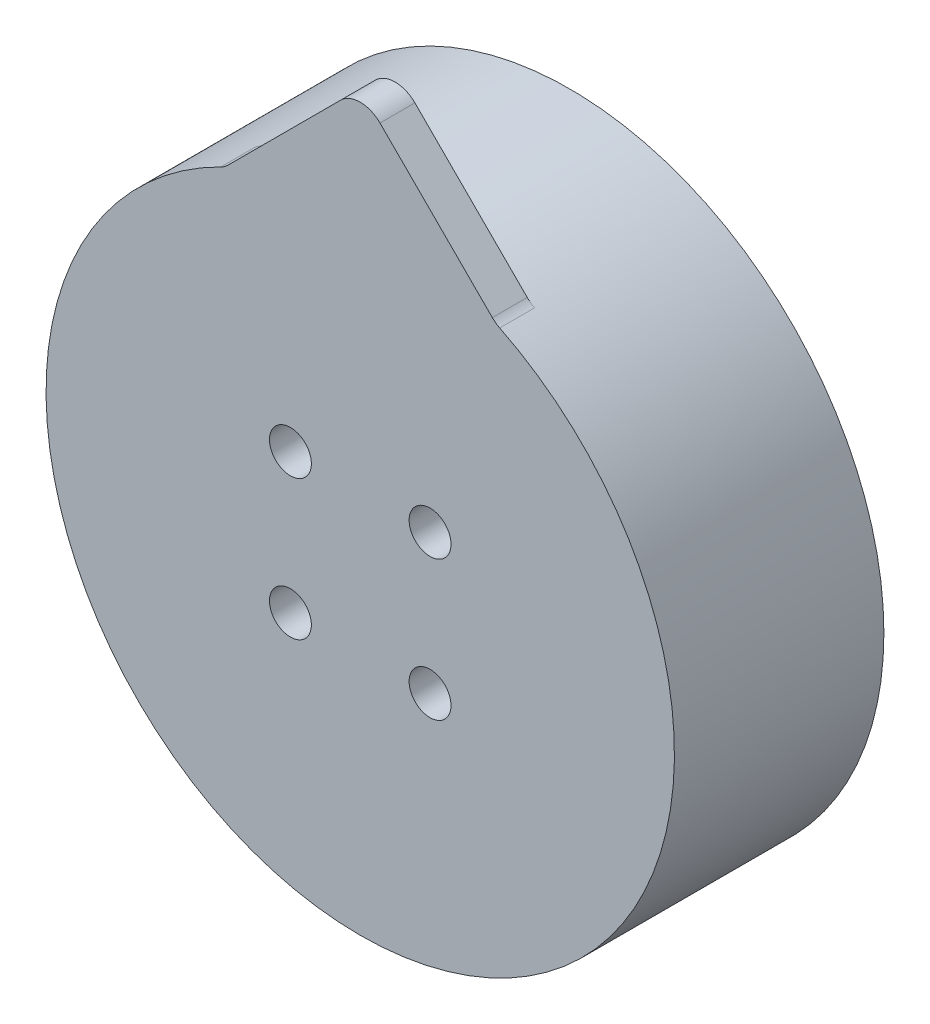
ISO-10303-21;
HEADER;
FILE_DESCRIPTION(('STEP AP214'),'2;1');
FILE_NAME('part.step','',(''),(''),'','','');
FILE_SCHEMA(('AUTOMOTIVE_DESIGN { 1 0 10303 214 1 1 1 1 }'));
ENDSEC;
DATA;
#1=APPLICATION_CONTEXT('core data for automotive mechanical design processes');
#2=APPLICATION_PROTOCOL_DEFINITION('international standard','automotive_design',2000,#1);
#3=PRODUCT_CONTEXT('',#1,'mechanical');
#4=PRODUCT('Part','Part','',(#3));
#5=PRODUCT_RELATED_PRODUCT_CATEGORY('part','',(#4));
#6=PRODUCT_DEFINITION_FORMATION('','',#4);
#7=PRODUCT_DEFINITION_CONTEXT('part definition',#1,'design');
#8=PRODUCT_DEFINITION('design','',#6,#7);
#9=PRODUCT_DEFINITION_SHAPE('','',#8);
#10=(LENGTH_UNIT() NAMED_UNIT(*) SI_UNIT(.MILLI.,.METRE.));
#11=(NAMED_UNIT(*) PLANE_ANGLE_UNIT() SI_UNIT($,.RADIAN.));
#12=(NAMED_UNIT(*) SI_UNIT($,.STERADIAN.) SOLID_ANGLE_UNIT());
#13=UNCERTAINTY_MEASURE_WITH_UNIT(LENGTH_MEASURE(1.E-05),#10,'distance_accuracy_value','');
#14=(GEOMETRIC_REPRESENTATION_CONTEXT(3) GLOBAL_UNCERTAINTY_ASSIGNED_CONTEXT((#13)) GLOBAL_UNIT_ASSIGNED_CONTEXT((#10,
#11,#12)) REPRESENTATION_CONTEXT('',''));
#15=CARTESIAN_POINT('',(0.,0.,0.));
#16=DIRECTION('',(0.,0.,1.));
#17=DIRECTION('',(1.,0.,0.));
#18=AXIS2_PLACEMENT_3D('',#15,#16,#17);
#19=CARTESIAN_POINT('',(0.,0.,12.7));
#20=DIRECTION('',(0.,0.,-1.));
#21=DIRECTION('',(-1.,0.,0.));
#22=AXIS2_PLACEMENT_3D('',#19,#20,#21);
#23=CYLINDRICAL_SURFACE('',#22,21.844);
#24=DIRECTION('',(0.,0.,-1.));
#25=VECTOR('',#24,1.);
#26=CARTESIAN_POINT('',(16.5270415262115,14.2834601687015,6.35));
#27=LINE('',#26,#25);
#28=CARTESIAN_POINT('',(16.5270415262115,14.2834601687015,0.));
#29=VERTEX_POINT('',#28);
#30=CARTESIAN_POINT('',(16.5270415262115,14.2834601687015,12.7));
#31=VERTEX_POINT('',#30);
#32=EDGE_CURVE('E282',#29,#31,#27,.F.);
#33=ORIENTED_EDGE('',*,*,#32,.F.);
#34=CARTESIAN_POINT('',(0.,0.,0.));
#35=DIRECTION('',(0.,0.,1.));
#36=DIRECTION('',(1.,0.,0.));
#37=AXIS2_PLACEMENT_3D('',#34,#35,#36);
#38=CIRCLE('',#37,21.844);
#39=CARTESIAN_POINT('',(21.7863146802326,1.58645159203908,0.));
#40=VERTEX_POINT('',#39);
#41=EDGE_CURVE('E212',#40,#29,#38,.T.);
#42=ORIENTED_EDGE('',*,*,#41,.F.);
#43=DIRECTION('',(0.,0.,-1.));
#44=VECTOR('',#43,1.);
#45=CARTESIAN_POINT('',(21.7863146802326,1.58645159203908,6.35));
#46=LINE('',#45,#44);
#47=CARTESIAN_POINT('',(21.7863146802326,1.5864515920391,12.7));
#48=VERTEX_POINT('',#47);
#49=EDGE_CURVE('E289',#48,#40,#46,.T.);
#50=ORIENTED_EDGE('',*,*,#49,.F.);
#51=CARTESIAN_POINT('',(0.,0.,12.7));
#52=DIRECTION('',(0.,0.,1.));
#53=DIRECTION('',(1.,0.,0.));
#54=AXIS2_PLACEMENT_3D('',#51,#52,#53);
#55=CIRCLE('',#54,21.844);
#56=EDGE_CURVE('E218',#48,#31,#55,.T.);
#57=ORIENTED_EDGE('',*,*,#56,.T.);
#58=EDGE_LOOP('',(#33,#42,#50,#57));
#59=FACE_BOUND('',#58,.T.);
#60=ADVANCED_FACE('F33',(#59),#23,.F.);
#61=DIRECTION('',(0.,0.,-1.));
#62=VECTOR('',#61,1.);
#63=CARTESIAN_POINT('',(21.7863146802326,-1.58645159203908,6.35));
#64=LINE('',#63,#62);
#65=CARTESIAN_POINT('',(21.7863146802326,-1.58645159203908,0.));
#66=VERTEX_POINT('',#65);
#67=CARTESIAN_POINT('',(21.7863146802326,-1.58645159203908,12.7));
#68=VERTEX_POINT('',#67);
#69=EDGE_CURVE('E287',#66,#68,#64,.F.);
#70=ORIENTED_EDGE('',*,*,#69,.F.);
#71=CARTESIAN_POINT('',(16.5270415262115,-14.2834601687015,0.));
#72=VERTEX_POINT('',#71);
#73=EDGE_CURVE('E217',#72,#66,#38,.T.);
#74=ORIENTED_EDGE('',*,*,#73,.F.);
#75=DIRECTION('',(0.,0.,-1.));
#76=VECTOR('',#75,1.);
#77=CARTESIAN_POINT('',(16.5270415262115,-14.2834601687015,6.35));
#78=LINE('',#77,#76);
#79=CARTESIAN_POINT('',(16.5270415262115,-14.2834601687015,12.7));
#80=VERTEX_POINT('',#79);
#81=EDGE_CURVE('E293',#80,#72,#78,.T.);
#82=ORIENTED_EDGE('',*,*,#81,.F.);
#83=EDGE_CURVE('E263',#80,#68,#55,.T.);
#84=ORIENTED_EDGE('',*,*,#83,.T.);
#85=EDGE_LOOP('',(#70,#74,#82,#84));
#86=FACE_BOUND('',#85,.T.);
#87=ADVANCED_FACE('F455',(#86),#23,.F.);
#88=DIRECTION('',(0.,0.,-1.));
#89=VECTOR('',#88,1.);
#90=CARTESIAN_POINT('',(14.2834601687014,-16.5270415262115,6.35));
#91=LINE('',#90,#89);
#92=CARTESIAN_POINT('',(14.2834601687014,-16.5270415262115,0.));
#93=VERTEX_POINT('',#92);
#94=CARTESIAN_POINT('',(14.2834601687014,-16.5270415262115,12.7));
#95=VERTEX_POINT('',#94);
#96=EDGE_CURVE('E291',#93,#95,#91,.F.);
#97=ORIENTED_EDGE('',*,*,#96,.F.);
#98=CARTESIAN_POINT('',(1.58645159203907,-21.7863146802326,0.));
#99=VERTEX_POINT('',#98);
#100=EDGE_CURVE('E469',#99,#93,#38,.T.);
#101=ORIENTED_EDGE('',*,*,#100,.F.);
#102=DIRECTION('',(0.,0.,-1.));
#103=VECTOR('',#102,1.);
#104=CARTESIAN_POINT('',(1.58645159203907,-21.7863146802326,6.35));
#105=LINE('',#104,#103);
#106=CARTESIAN_POINT('',(1.5864515920391,-21.7863146802326,12.7));
#107=VERTEX_POINT('',#106);
#108=EDGE_CURVE('E297',#107,#99,#105,.T.);
#109=ORIENTED_EDGE('',*,*,#108,.F.);
#110=EDGE_CURVE('E442',#107,#95,#55,.T.);
#111=ORIENTED_EDGE('',*,*,#110,.T.);
#112=EDGE_LOOP('',(#97,#101,#109,#111));
#113=FACE_BOUND('',#112,.T.);
#114=ADVANCED_FACE('F498',(#113),#23,.F.);
#115=DIRECTION('',(0.,0.,-1.));
#116=VECTOR('',#115,1.);
#117=CARTESIAN_POINT('',(-1.58645159203908,-21.7863146802326,6.35));
#118=LINE('',#117,#116);
#119=CARTESIAN_POINT('',(-1.58645159203908,-21.7863146802326,0.));
#120=VERTEX_POINT('',#119);
#121=CARTESIAN_POINT('',(-1.58645159203908,-21.7863146802326,12.7));
#122=VERTEX_POINT('',#121);
#123=EDGE_CURVE('E295',#120,#122,#118,.F.);
#124=ORIENTED_EDGE('',*,*,#123,.F.);
#125=CARTESIAN_POINT('',(-14.2834601687014,-16.5270415262115,0.));
#126=VERTEX_POINT('',#125);
#127=EDGE_CURVE('E470',#126,#120,#38,.T.);
#128=ORIENTED_EDGE('',*,*,#127,.F.);
#129=DIRECTION('',(0.,0.,-1.));
#130=VECTOR('',#129,1.);
#131=CARTESIAN_POINT('',(-14.2834601687014,-16.5270415262115,6.35));
#132=LINE('',#131,#130);
#133=CARTESIAN_POINT('',(-14.2834601687014,-16.5270415262115,12.7));
#134=VERTEX_POINT('',#133);
#135=EDGE_CURVE('E301',#134,#126,#132,.T.);
#136=ORIENTED_EDGE('',*,*,#135,.F.);
#137=EDGE_CURVE('E436',#134,#122,#55,.T.);
#138=ORIENTED_EDGE('',*,*,#137,.T.);
#139=EDGE_LOOP('',(#124,#128,#136,#138));
#140=FACE_BOUND('',#139,.T.);
#141=ADVANCED_FACE('F492',(#140),#23,.F.);
#142=DIRECTION('',(0.,0.,-1.));
#143=VECTOR('',#142,1.);
#144=CARTESIAN_POINT('',(-16.5270415262115,-14.2834601687015,6.35));
#145=LINE('',#144,#143);
#146=CARTESIAN_POINT('',(-16.5270415262115,-14.2834601687015,0.));
#147=VERTEX_POINT('',#146);
#148=CARTESIAN_POINT('',(-16.5270415262115,-14.2834601687015,12.7));
#149=VERTEX_POINT('',#148);
#150=EDGE_CURVE('E299',#147,#149,#145,.F.);
#151=ORIENTED_EDGE('',*,*,#150,.F.);
#152=CARTESIAN_POINT('',(-21.7863146802326,-1.58645159203908,0.));
#153=VERTEX_POINT('',#152);
#154=EDGE_CURVE('E213',#153,#147,#38,.T.);
#155=ORIENTED_EDGE('',*,*,#154,.F.);
#156=DIRECTION('',(0.,0.,-1.));
#157=VECTOR('',#156,1.);
#158=CARTESIAN_POINT('',(-21.7863146802326,-1.58645159203908,6.35));
#159=LINE('',#158,#157);
#160=CARTESIAN_POINT('',(-21.7863146802326,-1.5864515920391,12.7));
#161=VERTEX_POINT('',#160);
#162=EDGE_CURVE('E305',#161,#153,#159,.T.);
#163=ORIENTED_EDGE('',*,*,#162,.F.);
#164=EDGE_CURVE('E431',#161,#149,#55,.T.);
#165=ORIENTED_EDGE('',*,*,#164,.T.);
#166=EDGE_LOOP('',(#151,#155,#163,#165));
#167=FACE_BOUND('',#166,.T.);
#168=ADVANCED_FACE('F479',(#167),#23,.F.);
#169=DIRECTION('',(0.,0.,-1.));
#170=VECTOR('',#169,1.);
#171=CARTESIAN_POINT('',(-21.7863146802326,1.58645159203908,6.35));
#172=LINE('',#171,#170);
#173=CARTESIAN_POINT('',(-21.7863146802326,1.58645159203908,0.));
#174=VERTEX_POINT('',#173);
#175=CARTESIAN_POINT('',(-21.7863146802326,1.58645159203908,12.7));
#176=VERTEX_POINT('',#175);
#177=EDGE_CURVE('E303',#174,#176,#172,.F.);
#178=ORIENTED_EDGE('',*,*,#177,.F.);
#179=CARTESIAN_POINT('',(-16.5270415262115,14.2834601687015,0.));
#180=VERTEX_POINT('',#179);
#181=EDGE_CURVE('E210',#180,#174,#38,.T.);
#182=ORIENTED_EDGE('',*,*,#181,.F.);
#183=DIRECTION('',(0.,0.,-1.));
#184=VECTOR('',#183,1.);
#185=CARTESIAN_POINT('',(-16.5270415262115,14.2834601687015,6.35));
#186=LINE('',#185,#184);
#187=CARTESIAN_POINT('',(-16.5270415262115,14.2834601687015,12.7));
#188=VERTEX_POINT('',#187);
#189=EDGE_CURVE('E186',#188,#180,#186,.T.);
#190=ORIENTED_EDGE('',*,*,#189,.F.);
#191=EDGE_CURVE('E429',#188,#176,#55,.T.);
#192=ORIENTED_EDGE('',*,*,#191,.T.);
#193=EDGE_LOOP('',(#178,#182,#190,#192));
#194=FACE_BOUND('',#193,.T.);
#195=ADVANCED_FACE('F484',(#194),#23,.F.);
#196=DIRECTION('',(0.,0.,-1.));
#197=VECTOR('',#196,1.);
#198=CARTESIAN_POINT('',(14.2834601687014,16.5270415262115,6.35));
#199=LINE('',#198,#197);
#200=CARTESIAN_POINT('',(14.2834601687014,16.5270415262115,12.7));
#201=VERTEX_POINT('',#200);
#202=CARTESIAN_POINT('',(14.2834601687014,16.5270415262115,0.));
#203=VERTEX_POINT('',#202);
#204=EDGE_CURVE('E285',#201,#203,#199,.T.);
#205=ORIENTED_EDGE('',*,*,#204,.F.);
#206=CARTESIAN_POINT('',(1.58645159203907,21.7863146802326,12.7));
#207=VERTEX_POINT('',#206);
#208=EDGE_CURVE('E423',#201,#207,#55,.T.);
#209=ORIENTED_EDGE('',*,*,#208,.T.);
#210=DIRECTION('',(0.,0.,-1.));
#211=VECTOR('',#210,1.);
#212=CARTESIAN_POINT('',(1.58645159203907,21.7863146802326,6.35));
#213=LINE('',#212,#211);
#214=CARTESIAN_POINT('',(1.58645159203907,21.7863146802326,0.));
#215=VERTEX_POINT('',#214);
#216=EDGE_CURVE('E307',#215,#207,#213,.F.);
#217=ORIENTED_EDGE('',*,*,#216,.F.);
#218=EDGE_CURVE('E209',#203,#215,#38,.T.);
#219=ORIENTED_EDGE('',*,*,#218,.F.);
#220=EDGE_LOOP('',(#205,#209,#217,#219));
#221=FACE_BOUND('',#220,.T.);
#222=ADVANCED_FACE('F486',(#221),#23,.F.);
#223=CARTESIAN_POINT('',(0.,0.,0.));
#224=DIRECTION('',(0.,0.,1.));
#225=DIRECTION('',(1.,0.,0.));
#226=AXIS2_PLACEMENT_3D('',#223,#224,#225);
#227=PLANE('',#226);
#228=CARTESIAN_POINT('',(0.,0.,0.));
#229=DIRECTION('',(0.,0.,1.));
#230=DIRECTION('',(1.,0.,0.));
#231=AXIS2_PLACEMENT_3D('',#228,#229,#230);
#232=CIRCLE('',#231,28.575);
#233=CARTESIAN_POINT('',(28.575,0.,0.));
#234=VERTEX_POINT('',#233);
#235=EDGE_CURVE('E216',#234,#234,#232,.T.);
#236=ORIENTED_EDGE('',*,*,#235,.F.);
#237=EDGE_LOOP('',(#236));
#238=FACE_BOUND('',#237,.T.);
#239=ORIENTED_EDGE('',*,*,#41,.T.);
#240=CARTESIAN_POINT('',(15.4460405282389,15.446040528239,0.));
#241=DIRECTION('',(0.,0.,-1.));
#242=DIRECTION('',(-1.,0.,0.));
#243=AXIS2_PLACEMENT_3D('',#240,#241,#242);
#244=CIRCLE('',#243,1.5875);
#245=EDGE_CURVE('E316',#203,#29,#244,.T.);
#246=ORIENTED_EDGE('',*,*,#245,.F.);
#247=ORIENTED_EDGE('',*,*,#218,.T.);
#248=CARTESIAN_POINT('',(0.,21.844,0.));
#249=DIRECTION('',(0.,0.,-1.));
#250=DIRECTION('',(-1.,0.,0.));
#251=AXIS2_PLACEMENT_3D('',#248,#249,#250);
#252=CIRCLE('',#251,1.5875);
#253=CARTESIAN_POINT('',(-1.58645159203908,21.7863146802326,0.));
#254=VERTEX_POINT('',#253);
#255=EDGE_CURVE('E208',#254,#215,#252,.T.);
#256=ORIENTED_EDGE('',*,*,#255,.F.);
#257=CARTESIAN_POINT('',(-14.2834601687014,16.5270415262115,0.));
#258=VERTEX_POINT('',#257);
#259=EDGE_CURVE('E199',#254,#258,#38,.T.);
#260=ORIENTED_EDGE('',*,*,#259,.T.);
#261=CARTESIAN_POINT('',(-15.4460405282389,15.446040528239,0.));
#262=DIRECTION('',(0.,0.,-1.));
#263=DIRECTION('',(-1.,0.,0.));
#264=AXIS2_PLACEMENT_3D('',#261,#262,#263);
#265=CIRCLE('',#264,1.5875);
#266=EDGE_CURVE('E180',#180,#258,#265,.T.);
#267=ORIENTED_EDGE('',*,*,#266,.F.);
#268=ORIENTED_EDGE('',*,*,#181,.T.);
#269=CARTESIAN_POINT('',(-21.844,0.,0.));
#270=DIRECTION('',(0.,0.,-1.));
#271=DIRECTION('',(-1.,0.,0.));
#272=AXIS2_PLACEMENT_3D('',#269,#270,#271);
#273=CIRCLE('',#272,1.5875);
#274=EDGE_CURVE('E333',#153,#174,#273,.T.);
#275=ORIENTED_EDGE('',*,*,#274,.F.);
#276=ORIENTED_EDGE('',*,*,#154,.T.);
#277=CARTESIAN_POINT('',(-15.4460405282389,-15.446040528239,0.));
#278=DIRECTION('',(0.,0.,-1.));
#279=DIRECTION('',(-1.,0.,0.));
#280=AXIS2_PLACEMENT_3D('',#277,#278,#279);
#281=CIRCLE('',#280,1.5875);
#282=EDGE_CURVE('E328',#126,#147,#281,.T.);
#283=ORIENTED_EDGE('',*,*,#282,.F.);
#284=ORIENTED_EDGE('',*,*,#127,.T.);
#285=CARTESIAN_POINT('',(0.,-21.844,0.));
#286=DIRECTION('',(0.,0.,-1.));
#287=DIRECTION('',(-1.,0.,0.));
#288=AXIS2_PLACEMENT_3D('',#285,#286,#287);
#289=CIRCLE('',#288,1.5875);
#290=EDGE_CURVE('E325',#99,#120,#289,.T.);
#291=ORIENTED_EDGE('',*,*,#290,.F.);
#292=ORIENTED_EDGE('',*,*,#100,.T.);
#293=CARTESIAN_POINT('',(15.4460405282389,-15.446040528239,0.));
#294=DIRECTION('',(0.,0.,-1.));
#295=DIRECTION('',(-1.,0.,0.));
#296=AXIS2_PLACEMENT_3D('',#293,#294,#295);
#297=CIRCLE('',#296,1.5875);
#298=EDGE_CURVE('E322',#72,#93,#297,.T.);
#299=ORIENTED_EDGE('',*,*,#298,.F.);
#300=ORIENTED_EDGE('',*,*,#73,.T.);
#301=CARTESIAN_POINT('',(21.844,0.,0.));
#302=DIRECTION('',(0.,0.,-1.));
#303=DIRECTION('',(-1.,0.,0.));
#304=AXIS2_PLACEMENT_3D('',#301,#302,#303);
#305=CIRCLE('',#304,1.5875);
#306=EDGE_CURVE('E315',#40,#66,#305,.T.);
#307=ORIENTED_EDGE('',*,*,#306,.F.);
#308=EDGE_LOOP('',(#239,#246,#247,#256,#260,#267,#268,#275,#276,#283,#284,#291,#292,#299,#300,#307));
#309=FACE_BOUND('',#308,.T.);
#310=ADVANCED_FACE('F206',(#238,#309),#227,.F.);
#311=CARTESIAN_POINT('',(0.,0.,12.7));
#312=DIRECTION('',(0.,0.,-1.));
#313=DIRECTION('',(-1.,0.,0.));
#314=AXIS2_PLACEMENT_3D('',#311,#312,#313);
#315=CYLINDRICAL_SURFACE('',#314,28.575);
#316=CARTESIAN_POINT('',(0.,0.,15.875));
#317=DIRECTION('',(0.,0.,-1.));
#318=DIRECTION('',(1.,0.,0.));
#319=AXIS2_PLACEMENT_3D('',#316,#317,#318);
#320=CIRCLE('',#319,28.575);
#321=CARTESIAN_POINT('',(-12.6821476936652,25.6065178201969,15.875));
#322=VERTEX_POINT('',#321);
#323=CARTESIAN_POINT('',(12.6821476936652,25.6065178201969,15.875));
#324=VERTEX_POINT('',#323);
#325=EDGE_CURVE('E270',#322,#324,#320,.T.);
#326=ORIENTED_EDGE('',*,*,#325,.T.);
#327=DIRECTION('',(0.,0.,-1.));
#328=VECTOR('',#327,1.);
#329=CARTESIAN_POINT('',(12.6821476936652,25.6065178201969,12.7));
#330=LINE('',#329,#328);
#331=CARTESIAN_POINT('',(12.6821476936652,25.6065178201969,19.05));
#332=VERTEX_POINT('',#331);
#333=EDGE_CURVE('E239',#324,#332,#330,.F.);
#334=ORIENTED_EDGE('',*,*,#333,.T.);
#335=CARTESIAN_POINT('',(0.,0.,19.05));
#336=DIRECTION('',(0.,0.,1.));
#337=DIRECTION('',(1.,0.,0.));
#338=AXIS2_PLACEMENT_3D('',#335,#336,#337);
#339=CIRCLE('',#338,28.575);
#340=CARTESIAN_POINT('',(-12.6821476936652,25.6065178201969,19.05));
#341=VERTEX_POINT('',#340);
#342=EDGE_CURVE('E252',#341,#332,#339,.T.);
#343=ORIENTED_EDGE('',*,*,#342,.F.);
#344=DIRECTION('',(0.,0.,-1.));
#345=VECTOR('',#344,1.);
#346=CARTESIAN_POINT('',(-12.6821476936652,25.6065178201969,12.7));
#347=LINE('',#346,#345);
#348=EDGE_CURVE('E236',#341,#322,#347,.T.);
#349=ORIENTED_EDGE('',*,*,#348,.T.);
#350=EDGE_LOOP('',(#326,#334,#343,#349));
#351=FACE_BOUND('',#350,.T.);
#352=ORIENTED_EDGE('',*,*,#235,.T.);
#353=EDGE_LOOP('',(#352));
#354=FACE_BOUND('',#353,.T.);
#355=ADVANCED_FACE('F259',(#351,#354),#315,.T.);
#356=DIRECTION('',(0.,0.,-1.));
#357=VECTOR('',#356,1.);
#358=CARTESIAN_POINT('',(-1.58645159203908,21.7863146802326,6.35));
#359=LINE('',#358,#357);
#360=CARTESIAN_POINT('',(-1.58645159203911,21.7863146802326,12.7));
#361=VERTEX_POINT('',#360);
#362=EDGE_CURVE('E202',#361,#254,#359,.T.);
#363=ORIENTED_EDGE('',*,*,#362,.F.);
#364=CARTESIAN_POINT('',(-14.2834601687014,16.5270415262115,12.7));
#365=VERTEX_POINT('',#364);
#366=EDGE_CURVE('E201',#361,#365,#55,.T.);
#367=ORIENTED_EDGE('',*,*,#366,.T.);
#368=DIRECTION('',(0.,0.,-1.));
#369=VECTOR('',#368,1.);
#370=CARTESIAN_POINT('',(-14.2834601687014,16.5270415262115,6.35));
#371=LINE('',#370,#369);
#372=EDGE_CURVE('E183',#258,#365,#371,.F.);
#373=ORIENTED_EDGE('',*,*,#372,.F.);
#374=ORIENTED_EDGE('',*,*,#259,.F.);
#375=EDGE_LOOP('',(#363,#367,#373,#374));
#376=FACE_BOUND('',#375,.T.);
#377=ADVANCED_FACE('F198',(#376),#23,.F.);
#378=CARTESIAN_POINT('',(0.,0.,12.7));
#379=DIRECTION('',(0.,0.,1.));
#380=DIRECTION('',(1.,0.,0.));
#381=AXIS2_PLACEMENT_3D('',#378,#379,#380);
#382=PLANE('',#381);
#383=CARTESIAN_POINT('',(6.35,-6.35,12.7));
#384=DIRECTION('',(0.,0.,-1.));
#385=DIRECTION('',(-1.,0.,0.));
#386=AXIS2_PLACEMENT_3D('',#383,#384,#385);
#387=CIRCLE('',#386,3.175);
#388=CARTESIAN_POINT('',(3.175,-6.35,12.7));
#389=VERTEX_POINT('',#388);
#390=EDGE_CURVE('E348',#389,#389,#387,.T.);
#391=ORIENTED_EDGE('',*,*,#390,.F.);
#392=EDGE_LOOP('',(#391));
#393=FACE_BOUND('',#392,.T.);
#394=CARTESIAN_POINT('',(-6.35,-6.35,12.7));
#395=DIRECTION('',(0.,0.,-1.));
#396=DIRECTION('',(-1.,0.,0.));
#397=AXIS2_PLACEMENT_3D('',#394,#395,#396);
#398=CIRCLE('',#397,3.175);
#399=CARTESIAN_POINT('',(-9.525,-6.35,12.7));
#400=VERTEX_POINT('',#399);
#401=EDGE_CURVE('E355',#400,#400,#398,.T.);
#402=ORIENTED_EDGE('',*,*,#401,.F.);
#403=EDGE_LOOP('',(#402));
#404=FACE_BOUND('',#403,.T.);
#405=CARTESIAN_POINT('',(-6.35,6.35,12.7));
#406=DIRECTION('',(0.,0.,-1.));
#407=DIRECTION('',(-1.,0.,0.));
#408=AXIS2_PLACEMENT_3D('',#405,#406,#407);
#409=CIRCLE('',#408,3.175);
#410=CARTESIAN_POINT('',(-9.525,6.35,12.7));
#411=VERTEX_POINT('',#410);
#412=EDGE_CURVE('E361',#411,#411,#409,.T.);
#413=ORIENTED_EDGE('',*,*,#412,.F.);
#414=EDGE_LOOP('',(#413));
#415=FACE_BOUND('',#414,.T.);
#416=CARTESIAN_POINT('',(6.35,6.35,12.7));
#417=DIRECTION('',(0.,0.,-1.));
#418=DIRECTION('',(-1.,0.,0.));
#419=AXIS2_PLACEMENT_3D('',#416,#417,#418);
#420=CIRCLE('',#419,3.175);
#421=CARTESIAN_POINT('',(3.175,6.35,12.7));
#422=VERTEX_POINT('',#421);
#423=EDGE_CURVE('E342',#422,#422,#420,.T.);
#424=ORIENTED_EDGE('',*,*,#423,.F.);
#425=EDGE_LOOP('',(#424));
#426=FACE_BOUND('',#425,.T.);
#427=ORIENTED_EDGE('',*,*,#208,.F.);
#428=CARTESIAN_POINT('',(15.4460405282389,15.446040528239,12.7));
#429=DIRECTION('',(0.,0.,1.));
#430=DIRECTION('',(1.,0.,0.));
#431=AXIS2_PLACEMENT_3D('',#428,#429,#430);
#432=CIRCLE('',#431,1.5875);
#433=EDGE_CURVE('E312',#201,#31,#432,.F.);
#434=ORIENTED_EDGE('',*,*,#433,.T.);
#435=ORIENTED_EDGE('',*,*,#56,.F.);
#436=CARTESIAN_POINT('',(21.844,0.,12.7));
#437=DIRECTION('',(0.,0.,1.));
#438=DIRECTION('',(1.,0.,0.));
#439=AXIS2_PLACEMENT_3D('',#436,#437,#438);
#440=CIRCLE('',#439,1.5875);
#441=EDGE_CURVE('E319',#48,#68,#440,.F.);
#442=ORIENTED_EDGE('',*,*,#441,.T.);
#443=ORIENTED_EDGE('',*,*,#83,.F.);
#444=CARTESIAN_POINT('',(15.4460405282389,-15.446040528239,12.7));
#445=DIRECTION('',(0.,0.,1.));
#446=DIRECTION('',(1.,0.,0.));
#447=AXIS2_PLACEMENT_3D('',#444,#445,#446);
#448=CIRCLE('',#447,1.5875);
#449=EDGE_CURVE('E48',#80,#95,#448,.F.);
#450=ORIENTED_EDGE('',*,*,#449,.T.);
#451=ORIENTED_EDGE('',*,*,#110,.F.);
#452=CARTESIAN_POINT('',(0.,-21.844,12.7));
#453=DIRECTION('',(0.,0.,1.));
#454=DIRECTION('',(1.,0.,0.));
#455=AXIS2_PLACEMENT_3D('',#452,#453,#454);
#456=CIRCLE('',#455,1.5875);
#457=EDGE_CURVE('E56',#107,#122,#456,.F.);
#458=ORIENTED_EDGE('',*,*,#457,.T.);
#459=ORIENTED_EDGE('',*,*,#137,.F.);
#460=CARTESIAN_POINT('',(-15.4460405282389,-15.446040528239,12.7));
#461=DIRECTION('',(0.,0.,1.));
#462=DIRECTION('',(1.,0.,0.));
#463=AXIS2_PLACEMENT_3D('',#460,#461,#462);
#464=CIRCLE('',#463,1.5875);
#465=EDGE_CURVE('E330',#134,#149,#464,.F.);
#466=ORIENTED_EDGE('',*,*,#465,.T.);
#467=ORIENTED_EDGE('',*,*,#164,.F.);
#468=CARTESIAN_POINT('',(-21.844,0.,12.7));
#469=DIRECTION('',(0.,0.,1.));
#470=DIRECTION('',(1.,0.,0.));
#471=AXIS2_PLACEMENT_3D('',#468,#469,#470);
#472=CIRCLE('',#471,1.5875);
#473=EDGE_CURVE('E335',#161,#176,#472,.F.);
#474=ORIENTED_EDGE('',*,*,#473,.T.);
#475=ORIENTED_EDGE('',*,*,#191,.F.);
#476=CARTESIAN_POINT('',(-15.4460405282389,15.446040528239,12.7));
#477=DIRECTION('',(0.,0.,1.));
#478=DIRECTION('',(1.,0.,0.));
#479=AXIS2_PLACEMENT_3D('',#476,#477,#478);
#480=CIRCLE('',#479,1.5875);
#481=EDGE_CURVE('E191',#188,#365,#480,.F.);
#482=ORIENTED_EDGE('',*,*,#481,.T.);
#483=ORIENTED_EDGE('',*,*,#366,.F.);
#484=CARTESIAN_POINT('',(0.,21.844,12.7));
#485=DIRECTION('',(0.,0.,1.));
#486=DIRECTION('',(1.,0.,0.));
#487=AXIS2_PLACEMENT_3D('',#484,#485,#486);
#488=CIRCLE('',#487,1.5875);
#489=EDGE_CURVE('E192',#361,#207,#488,.F.);
#490=ORIENTED_EDGE('',*,*,#489,.T.);
#491=EDGE_LOOP('',(#427,#434,#435,#442,#443,#450,#451,#458,#459,#466,#467,#474,#475,#482,#483,#490));
#492=FACE_BOUND('',#491,.T.);
#493=ADVANCED_FACE('F414',(#393,#404,#415,#426,#492),#382,.F.);
#494=CARTESIAN_POINT('',(0.,0.,19.05));
#495=DIRECTION('',(0.,0.,1.));
#496=DIRECTION('',(1.,0.,0.));
#497=AXIS2_PLACEMENT_3D('',#494,#495,#496);
#498=PLANE('',#497);
#499=CARTESIAN_POINT('',(6.35,-6.35,19.05));
#500=DIRECTION('',(0.,0.,-1.));
#501=DIRECTION('',(-1.,0.,0.));
#502=AXIS2_PLACEMENT_3D('',#499,#500,#501);
#503=CIRCLE('',#502,1.905);
#504=CARTESIAN_POINT('',(4.445,-6.35,19.05));
#505=VERTEX_POINT('',#504);
#506=EDGE_CURVE('E375',#505,#505,#503,.T.);
#507=ORIENTED_EDGE('',*,*,#506,.T.);
#508=EDGE_LOOP('',(#507));
#509=FACE_BOUND('',#508,.T.);
#510=CARTESIAN_POINT('',(-6.35,-6.35,19.05));
#511=DIRECTION('',(0.,0.,-1.));
#512=DIRECTION('',(-1.,0.,0.));
#513=AXIS2_PLACEMENT_3D('',#510,#511,#512);
#514=CIRCLE('',#513,1.905);
#515=CARTESIAN_POINT('',(-8.255,-6.35,19.05));
#516=VERTEX_POINT('',#515);
#517=EDGE_CURVE('E381',#516,#516,#514,.T.);
#518=ORIENTED_EDGE('',*,*,#517,.T.);
#519=EDGE_LOOP('',(#518));
#520=FACE_BOUND('',#519,.T.);
#521=CARTESIAN_POINT('',(-6.35,6.35,19.05));
#522=DIRECTION('',(0.,0.,-1.));
#523=DIRECTION('',(-1.,0.,0.));
#524=AXIS2_PLACEMENT_3D('',#521,#522,#523);
#525=CIRCLE('',#524,1.905);
#526=CARTESIAN_POINT('',(-8.255,6.35,19.05));
#527=VERTEX_POINT('',#526);
#528=EDGE_CURVE('E369',#527,#527,#525,.T.);
#529=ORIENTED_EDGE('',*,*,#528,.T.);
#530=EDGE_LOOP('',(#529));
#531=FACE_BOUND('',#530,.T.);
#532=CARTESIAN_POINT('',(6.35,6.35,19.05));
#533=DIRECTION('',(0.,0.,-1.));
#534=DIRECTION('',(-1.,0.,0.));
#535=AXIS2_PLACEMENT_3D('',#532,#533,#534);
#536=CIRCLE('',#535,1.905);
#537=CARTESIAN_POINT('',(4.445,6.35,19.05));
#538=VERTEX_POINT('',#537);
#539=EDGE_CURVE('E352',#538,#538,#536,.T.);
#540=ORIENTED_EDGE('',*,*,#539,.T.);
#541=EDGE_LOOP('',(#540));
#542=FACE_BOUND('',#541,.T.);
#543=DIRECTION('',(-0.707106781186547,0.707106781186548,0.));
#544=VECTOR('',#543,1.);
#545=CARTESIAN_POINT('',(0.,38.1,19.05));
#546=LINE('',#545,#544);
#547=CARTESIAN_POINT('',(12.013398486666,26.0866015133339,19.05));
#548=VERTEX_POINT('',#547);
#549=CARTESIAN_POINT('',(1.79605122421383,36.3039487757862,19.05));
#550=VERTEX_POINT('',#549);
#551=EDGE_CURVE('E280',#548,#550,#546,.T.);
#552=ORIENTED_EDGE('',*,*,#551,.T.);
#553=CARTESIAN_POINT('',(0.,34.5078975515723,19.05));
#554=DIRECTION('',(0.,0.,1.));
#555=DIRECTION('',(1.,0.,0.));
#556=AXIS2_PLACEMENT_3D('',#553,#554,#555);
#557=CIRCLE('',#556,2.54);
#558=CARTESIAN_POINT('',(-1.79605122421383,36.3039487757862,19.05));
#559=VERTEX_POINT('',#558);
#560=EDGE_CURVE('E227',#550,#559,#557,.T.);
#561=ORIENTED_EDGE('',*,*,#560,.T.);
#562=DIRECTION('',(-0.707106781186547,-0.707106781186548,0.));
#563=VECTOR('',#562,1.);
#564=CARTESIAN_POINT('',(-12.3148079091981,25.7851920908019,19.05));
#565=LINE('',#564,#563);
#566=CARTESIAN_POINT('',(-12.0133984866661,26.0866015133339,19.05));
#567=VERTEX_POINT('',#566);
#568=EDGE_CURVE('E254',#559,#567,#565,.T.);
#569=ORIENTED_EDGE('',*,*,#568,.T.);
#570=CARTESIAN_POINT('',(-13.8094497108799,27.8826527375478,19.05));
#571=DIRECTION('',(0.,0.,1.));
#572=DIRECTION('',(1.,0.,0.));
#573=AXIS2_PLACEMENT_3D('',#570,#571,#572);
#574=CIRCLE('',#573,2.54);
#575=EDGE_CURVE('E41',#567,#341,#574,.F.);
#576=ORIENTED_EDGE('',*,*,#575,.T.);
#577=ORIENTED_EDGE('',*,*,#342,.T.);
#578=CARTESIAN_POINT('',(13.8094497108799,27.8826527375478,19.05));
#579=DIRECTION('',(0.,0.,1.));
#580=DIRECTION('',(1.,0.,0.));
#581=AXIS2_PLACEMENT_3D('',#578,#579,#580);
#582=CIRCLE('',#581,2.54);
#583=EDGE_CURVE('E242',#332,#548,#582,.F.);
#584=ORIENTED_EDGE('',*,*,#583,.T.);
#585=EDGE_LOOP('',(#552,#561,#569,#576,#577,#584));
#586=FACE_BOUND('',#585,.T.);
#587=ADVANCED_FACE('F251',(#509,#520,#531,#542,#586),#498,.T.);
#588=CARTESIAN_POINT('',(-12.3148079091981,25.7851920908019,15.875));
#589=DIRECTION('',(-0.707106781186548,0.707106781186547,0.));
#590=DIRECTION('',(-0.707106781186547,-0.707106781186548,0.));
#591=AXIS2_PLACEMENT_3D('',#588,#589,#590);
#592=PLANE('',#591);
#593=ORIENTED_EDGE('',*,*,#568,.F.);
#594=DIRECTION('',(0.,0.,1.));
#595=VECTOR('',#594,1.);
#596=CARTESIAN_POINT('',(-1.79605122421383,36.3039487757862,15.875));
#597=LINE('',#596,#595);
#598=CARTESIAN_POINT('',(-1.79605122421383,36.3039487757862,15.875));
#599=VERTEX_POINT('',#598);
#600=EDGE_CURVE('E232',#559,#599,#597,.F.);
#601=ORIENTED_EDGE('',*,*,#600,.T.);
#602=DIRECTION('',(-0.707106781186547,-0.707106781186548,0.));
#603=VECTOR('',#602,1.);
#604=CARTESIAN_POINT('',(-12.3148079091981,25.7851920908019,15.875));
#605=LINE('',#604,#603);
#606=CARTESIAN_POINT('',(-12.0133984866661,26.0866015133339,15.875));
#607=VERTEX_POINT('',#606);
#608=EDGE_CURVE('E264',#599,#607,#605,.T.);
#609=ORIENTED_EDGE('',*,*,#608,.T.);
#610=DIRECTION('',(0.,0.,-1.));
#611=VECTOR('',#610,1.);
#612=CARTESIAN_POINT('',(-12.0133984866661,26.0866015133339,15.875));
#613=LINE('',#612,#611);
#614=EDGE_CURVE('E229',#607,#567,#613,.F.);
#615=ORIENTED_EDGE('',*,*,#614,.T.);
#616=EDGE_LOOP('',(#593,#601,#609,#615));
#617=FACE_BOUND('',#616,.T.);
#618=ADVANCED_FACE('F272',(#617),#592,.T.);
#619=CARTESIAN_POINT('',(0.,38.1,15.875));
#620=DIRECTION('',(0.707106781186548,0.707106781186547,0.));
#621=DIRECTION('',(-0.707106781186547,0.707106781186548,0.));
#622=AXIS2_PLACEMENT_3D('',#619,#620,#621);
#623=PLANE('',#622);
#624=DIRECTION('',(-0.707106781186547,0.707106781186548,0.));
#625=VECTOR('',#624,1.);
#626=CARTESIAN_POINT('',(0.,38.1,15.875));
#627=LINE('',#626,#625);
#628=CARTESIAN_POINT('',(12.013398486666,26.0866015133339,15.875));
#629=VERTEX_POINT('',#628);
#630=CARTESIAN_POINT('',(1.79605122421383,36.3039487757862,15.875));
#631=VERTEX_POINT('',#630);
#632=EDGE_CURVE('E274',#629,#631,#627,.T.);
#633=ORIENTED_EDGE('',*,*,#632,.T.);
#634=DIRECTION('',(0.,0.,1.));
#635=VECTOR('',#634,1.);
#636=CARTESIAN_POINT('',(1.79605122421383,36.3039487757862,15.875));
#637=LINE('',#636,#635);
#638=EDGE_CURVE('E224',#631,#550,#637,.T.);
#639=ORIENTED_EDGE('',*,*,#638,.T.);
#640=ORIENTED_EDGE('',*,*,#551,.F.);
#641=DIRECTION('',(0.,0.,-1.));
#642=VECTOR('',#641,1.);
#643=CARTESIAN_POINT('',(12.013398486666,26.0866015133339,15.875));
#644=LINE('',#643,#642);
#645=EDGE_CURVE('E222',#548,#629,#644,.T.);
#646=ORIENTED_EDGE('',*,*,#645,.T.);
#647=EDGE_LOOP('',(#633,#639,#640,#646));
#648=FACE_BOUND('',#647,.T.);
#649=ADVANCED_FACE('F523',(#648),#623,.T.);
#650=CARTESIAN_POINT('',(0.,0.,15.875));
#651=DIRECTION('',(0.,0.,1.));
#652=DIRECTION('',(1.,0.,0.));
#653=AXIS2_PLACEMENT_3D('',#650,#651,#652);
#654=PLANE('',#653);
#655=ORIENTED_EDGE('',*,*,#608,.F.);
#656=CARTESIAN_POINT('',(0.,34.5078975515723,15.875));
#657=DIRECTION('',(0.,0.,1.));
#658=DIRECTION('',(1.,0.,0.));
#659=AXIS2_PLACEMENT_3D('',#656,#657,#658);
#660=CIRCLE('',#659,2.54);
#661=EDGE_CURVE('E234',#599,#631,#660,.F.);
#662=ORIENTED_EDGE('',*,*,#661,.T.);
#663=ORIENTED_EDGE('',*,*,#632,.F.);
#664=CARTESIAN_POINT('',(13.8094497108799,27.8826527375478,15.875));
#665=DIRECTION('',(0.,0.,1.));
#666=DIRECTION('',(1.,0.,0.));
#667=AXIS2_PLACEMENT_3D('',#664,#665,#666);
#668=CIRCLE('',#667,2.54);
#669=EDGE_CURVE('E244',#629,#324,#668,.T.);
#670=ORIENTED_EDGE('',*,*,#669,.T.);
#671=ORIENTED_EDGE('',*,*,#325,.F.);
#672=CARTESIAN_POINT('',(-13.8094497108799,27.8826527375478,15.875));
#673=DIRECTION('',(0.,0.,1.));
#674=DIRECTION('',(1.,0.,0.));
#675=AXIS2_PLACEMENT_3D('',#672,#673,#674);
#676=CIRCLE('',#675,2.54);
#677=EDGE_CURVE('E11',#322,#607,#676,.T.);
#678=ORIENTED_EDGE('',*,*,#677,.T.);
#679=EDGE_LOOP('',(#655,#662,#663,#670,#671,#678));
#680=FACE_BOUND('',#679,.T.);
#681=ADVANCED_FACE('F268',(#680),#654,.F.);
#682=CARTESIAN_POINT('',(0.,34.5078975515723,15.875));
#683=DIRECTION('',(0.,0.,1.));
#684=DIRECTION('',(1.,0.,0.));
#685=AXIS2_PLACEMENT_3D('',#682,#683,#684);
#686=CYLINDRICAL_SURFACE('',#685,2.54);
#687=ORIENTED_EDGE('',*,*,#661,.F.);
#688=ORIENTED_EDGE('',*,*,#600,.F.);
#689=ORIENTED_EDGE('',*,*,#560,.F.);
#690=ORIENTED_EDGE('',*,*,#638,.F.);
#691=EDGE_LOOP('',(#687,#688,#689,#690));
#692=FACE_BOUND('',#691,.T.);
#693=ADVANCED_FACE('F509',(#692),#686,.T.);
#694=CARTESIAN_POINT('',(13.8094497108799,27.8826527375478,12.7));
#695=DIRECTION('',(0.,0.,-1.));
#696=DIRECTION('',(-1.,0.,0.));
#697=AXIS2_PLACEMENT_3D('',#694,#695,#696);
#698=CYLINDRICAL_SURFACE('',#697,2.54);
#699=ORIENTED_EDGE('',*,*,#669,.F.);
#700=ORIENTED_EDGE('',*,*,#645,.F.);
#701=ORIENTED_EDGE('',*,*,#583,.F.);
#702=ORIENTED_EDGE('',*,*,#333,.F.);
#703=EDGE_LOOP('',(#699,#700,#701,#702));
#704=FACE_BOUND('',#703,.T.);
#705=ADVANCED_FACE('F511',(#704),#698,.F.);
#706=CARTESIAN_POINT('',(-13.8094497108799,27.8826527375478,12.7));
#707=DIRECTION('',(0.,0.,-1.));
#708=DIRECTION('',(-1.,0.,0.));
#709=AXIS2_PLACEMENT_3D('',#706,#707,#708);
#710=CYLINDRICAL_SURFACE('',#709,2.54);
#711=ORIENTED_EDGE('',*,*,#677,.F.);
#712=ORIENTED_EDGE('',*,*,#348,.F.);
#713=ORIENTED_EDGE('',*,*,#575,.F.);
#714=ORIENTED_EDGE('',*,*,#614,.F.);
#715=EDGE_LOOP('',(#711,#712,#713,#714));
#716=FACE_BOUND('',#715,.T.);
#717=ADVANCED_FACE('F35',(#716),#710,.F.);
#718=CARTESIAN_POINT('',(-15.4460405282389,15.446040528239,17.1901280605346));
#719=DIRECTION('',(0.,0.,-1.));
#720=DIRECTION('',(-1.,0.,0.));
#721=AXIS2_PLACEMENT_3D('',#718,#719,#720);
#722=CYLINDRICAL_SURFACE('',#721,1.5875);
#723=ORIENTED_EDGE('',*,*,#372,.T.);
#724=ORIENTED_EDGE('',*,*,#481,.F.);
#725=ORIENTED_EDGE('',*,*,#189,.T.);
#726=ORIENTED_EDGE('',*,*,#266,.T.);
#727=EDGE_LOOP('',(#723,#724,#725,#726));
#728=FACE_BOUND('',#727,.T.);
#729=ADVANCED_FACE('F182',(#728),#722,.F.);
#730=CARTESIAN_POINT('',(0.,21.844,17.1901280605346));
#731=DIRECTION('',(0.,0.,-1.));
#732=DIRECTION('',(-1.,0.,0.));
#733=AXIS2_PLACEMENT_3D('',#730,#731,#732);
#734=CYLINDRICAL_SURFACE('',#733,1.5875);
#735=ORIENTED_EDGE('',*,*,#216,.T.);
#736=ORIENTED_EDGE('',*,*,#489,.F.);
#737=ORIENTED_EDGE('',*,*,#362,.T.);
#738=ORIENTED_EDGE('',*,*,#255,.T.);
#739=EDGE_LOOP('',(#735,#736,#737,#738));
#740=FACE_BOUND('',#739,.T.);
#741=ADVANCED_FACE('F578',(#740),#734,.F.);
#742=CARTESIAN_POINT('',(-21.844,0.,17.1901280605346));
#743=DIRECTION('',(0.,0.,-1.));
#744=DIRECTION('',(-1.,0.,0.));
#745=AXIS2_PLACEMENT_3D('',#742,#743,#744);
#746=CYLINDRICAL_SURFACE('',#745,1.5875);
#747=ORIENTED_EDGE('',*,*,#177,.T.);
#748=ORIENTED_EDGE('',*,*,#473,.F.);
#749=ORIENTED_EDGE('',*,*,#162,.T.);
#750=ORIENTED_EDGE('',*,*,#274,.T.);
#751=EDGE_LOOP('',(#747,#748,#749,#750));
#752=FACE_BOUND('',#751,.T.);
#753=ADVANCED_FACE('F483',(#752),#746,.F.);
#754=CARTESIAN_POINT('',(-15.4460405282389,-15.446040528239,17.1901280605346));
#755=DIRECTION('',(0.,0.,-1.));
#756=DIRECTION('',(-1.,0.,0.));
#757=AXIS2_PLACEMENT_3D('',#754,#755,#756);
#758=CYLINDRICAL_SURFACE('',#757,1.5875);
#759=ORIENTED_EDGE('',*,*,#150,.T.);
#760=ORIENTED_EDGE('',*,*,#465,.F.);
#761=ORIENTED_EDGE('',*,*,#135,.T.);
#762=ORIENTED_EDGE('',*,*,#282,.T.);
#763=EDGE_LOOP('',(#759,#760,#761,#762));
#764=FACE_BOUND('',#763,.T.);
#765=ADVANCED_FACE('F481',(#764),#758,.F.);
#766=CARTESIAN_POINT('',(0.,-21.844,17.1901280605346));
#767=DIRECTION('',(0.,0.,-1.));
#768=DIRECTION('',(-1.,0.,0.));
#769=AXIS2_PLACEMENT_3D('',#766,#767,#768);
#770=CYLINDRICAL_SURFACE('',#769,1.5875);
#771=ORIENTED_EDGE('',*,*,#123,.T.);
#772=ORIENTED_EDGE('',*,*,#457,.F.);
#773=ORIENTED_EDGE('',*,*,#108,.T.);
#774=ORIENTED_EDGE('',*,*,#290,.T.);
#775=EDGE_LOOP('',(#771,#772,#773,#774));
#776=FACE_BOUND('',#775,.T.);
#777=ADVANCED_FACE('F586',(#776),#770,.F.);
#778=CARTESIAN_POINT('',(15.4460405282389,-15.446040528239,17.1901280605346));
#779=DIRECTION('',(0.,0.,-1.));
#780=DIRECTION('',(-1.,0.,0.));
#781=AXIS2_PLACEMENT_3D('',#778,#779,#780);
#782=CYLINDRICAL_SURFACE('',#781,1.5875);
#783=ORIENTED_EDGE('',*,*,#96,.T.);
#784=ORIENTED_EDGE('',*,*,#449,.F.);
#785=ORIENTED_EDGE('',*,*,#81,.T.);
#786=ORIENTED_EDGE('',*,*,#298,.T.);
#787=EDGE_LOOP('',(#783,#784,#785,#786));
#788=FACE_BOUND('',#787,.T.);
#789=ADVANCED_FACE('F589',(#788),#782,.F.);
#790=CARTESIAN_POINT('',(21.844,0.,17.1901280605346));
#791=DIRECTION('',(0.,0.,-1.));
#792=DIRECTION('',(-1.,0.,0.));
#793=AXIS2_PLACEMENT_3D('',#790,#791,#792);
#794=CYLINDRICAL_SURFACE('',#793,1.5875);
#795=ORIENTED_EDGE('',*,*,#69,.T.);
#796=ORIENTED_EDGE('',*,*,#441,.F.);
#797=ORIENTED_EDGE('',*,*,#49,.T.);
#798=ORIENTED_EDGE('',*,*,#306,.T.);
#799=EDGE_LOOP('',(#795,#796,#797,#798));
#800=FACE_BOUND('',#799,.T.);
#801=ADVANCED_FACE('F460',(#800),#794,.F.);
#802=CARTESIAN_POINT('',(15.4460405282389,15.446040528239,17.1901280605346));
#803=DIRECTION('',(0.,0.,-1.));
#804=DIRECTION('',(-1.,0.,0.));
#805=AXIS2_PLACEMENT_3D('',#802,#803,#804);
#806=CYLINDRICAL_SURFACE('',#805,1.5875);
#807=ORIENTED_EDGE('',*,*,#32,.T.);
#808=ORIENTED_EDGE('',*,*,#433,.F.);
#809=ORIENTED_EDGE('',*,*,#204,.T.);
#810=ORIENTED_EDGE('',*,*,#245,.T.);
#811=EDGE_LOOP('',(#807,#808,#809,#810));
#812=FACE_BOUND('',#811,.T.);
#813=ADVANCED_FACE('F576',(#812),#806,.F.);
#814=CARTESIAN_POINT('',(6.35,6.35,15.875));
#815=DIRECTION('',(0.,0.,-1.));
#816=DIRECTION('',(-1.,0.,0.));
#817=AXIS2_PLACEMENT_3D('',#814,#815,#816);
#818=CYLINDRICAL_SURFACE('',#817,3.175);
#819=CARTESIAN_POINT('',(6.35,6.35,15.875));
#820=DIRECTION('',(0.,0.,-1.));
#821=DIRECTION('',(-1.,0.,0.));
#822=AXIS2_PLACEMENT_3D('',#819,#820,#821);
#823=CIRCLE('',#822,3.175);
#824=CARTESIAN_POINT('',(3.175,6.35,15.875));
#825=VERTEX_POINT('',#824);
#826=EDGE_CURVE('E318',#825,#825,#823,.T.);
#827=ORIENTED_EDGE('',*,*,#826,.F.);
#828=EDGE_LOOP('',(#827));
#829=FACE_BOUND('',#828,.T.);
#830=ORIENTED_EDGE('',*,*,#423,.T.);
#831=EDGE_LOOP('',(#830));
#832=FACE_BOUND('',#831,.T.);
#833=ADVANCED_FACE('F572',(#829,#832),#818,.F.);
#834=CARTESIAN_POINT('',(6.35,6.35,15.875));
#835=DIRECTION('',(0.,0.,-1.));
#836=DIRECTION('',(-1.,0.,0.));
#837=AXIS2_PLACEMENT_3D('',#834,#835,#836);
#838=PLANE('',#837);
#839=CARTESIAN_POINT('',(6.35,6.35,15.875));
#840=DIRECTION('',(0.,0.,-1.));
#841=DIRECTION('',(-1.,0.,0.));
#842=AXIS2_PLACEMENT_3D('',#839,#840,#841);
#843=CIRCLE('',#842,1.905);
#844=CARTESIAN_POINT('',(4.445,6.35,15.875));
#845=VERTEX_POINT('',#844);
#846=EDGE_CURVE('E366',#845,#845,#843,.T.);
#847=ORIENTED_EDGE('',*,*,#846,.F.);
#848=EDGE_LOOP('',(#847));
#849=FACE_BOUND('',#848,.T.);
#850=ORIENTED_EDGE('',*,*,#826,.T.);
#851=EDGE_LOOP('',(#850));
#852=FACE_BOUND('',#851,.T.);
#853=ADVANCED_FACE('F410',(#849,#852),#838,.T.);
#854=CARTESIAN_POINT('',(-6.35,6.35,15.875));
#855=DIRECTION('',(0.,0.,-1.));
#856=DIRECTION('',(-1.,0.,0.));
#857=AXIS2_PLACEMENT_3D('',#854,#855,#856);
#858=CYLINDRICAL_SURFACE('',#857,3.175);
#859=CARTESIAN_POINT('',(-6.35,6.35,15.875));
#860=DIRECTION('',(0.,0.,-1.));
#861=DIRECTION('',(-1.,0.,0.));
#862=AXIS2_PLACEMENT_3D('',#859,#860,#861);
#863=CIRCLE('',#862,3.175);
#864=CARTESIAN_POINT('',(-9.525,6.35,15.875));
#865=VERTEX_POINT('',#864);
#866=EDGE_CURVE('E345',#865,#865,#863,.T.);
#867=ORIENTED_EDGE('',*,*,#866,.F.);
#868=EDGE_LOOP('',(#867));
#869=FACE_BOUND('',#868,.T.);
#870=ORIENTED_EDGE('',*,*,#412,.T.);
#871=EDGE_LOOP('',(#870));
#872=FACE_BOUND('',#871,.T.);
#873=ADVANCED_FACE('F404',(#869,#872),#858,.F.);
#874=CARTESIAN_POINT('',(-6.35,6.35,15.875));
#875=DIRECTION('',(0.,0.,-1.));
#876=DIRECTION('',(-1.,0.,0.));
#877=AXIS2_PLACEMENT_3D('',#874,#875,#876);
#878=PLANE('',#877);
#879=CARTESIAN_POINT('',(-6.35,6.35,15.875));
#880=DIRECTION('',(0.,0.,-1.));
#881=DIRECTION('',(-1.,0.,0.));
#882=AXIS2_PLACEMENT_3D('',#879,#880,#881);
#883=CIRCLE('',#882,1.905);
#884=CARTESIAN_POINT('',(-8.255,6.35,15.875));
#885=VERTEX_POINT('',#884);
#886=EDGE_CURVE('E384',#885,#885,#883,.T.);
#887=ORIENTED_EDGE('',*,*,#886,.F.);
#888=EDGE_LOOP('',(#887));
#889=FACE_BOUND('',#888,.T.);
#890=ORIENTED_EDGE('',*,*,#866,.T.);
#891=EDGE_LOOP('',(#890));
#892=FACE_BOUND('',#891,.T.);
#893=ADVANCED_FACE('F400',(#889,#892),#878,.T.);
#894=CARTESIAN_POINT('',(-6.35,-6.35,15.875));
#895=DIRECTION('',(0.,0.,-1.));
#896=DIRECTION('',(-1.,0.,0.));
#897=AXIS2_PLACEMENT_3D('',#894,#895,#896);
#898=CYLINDRICAL_SURFACE('',#897,3.175);
#899=CARTESIAN_POINT('',(-6.35,-6.35,15.875));
#900=DIRECTION('',(0.,0.,-1.));
#901=DIRECTION('',(-1.,0.,0.));
#902=AXIS2_PLACEMENT_3D('',#899,#900,#901);
#903=CIRCLE('',#902,3.175);
#904=CARTESIAN_POINT('',(-9.525,-6.35,15.875));
#905=VERTEX_POINT('',#904);
#906=EDGE_CURVE('E358',#905,#905,#903,.T.);
#907=ORIENTED_EDGE('',*,*,#906,.F.);
#908=EDGE_LOOP('',(#907));
#909=FACE_BOUND('',#908,.T.);
#910=ORIENTED_EDGE('',*,*,#401,.T.);
#911=EDGE_LOOP('',(#910));
#912=FACE_BOUND('',#911,.T.);
#913=ADVANCED_FACE('F403',(#909,#912),#898,.F.);
#914=CARTESIAN_POINT('',(-6.35,-6.35,15.875));
#915=DIRECTION('',(0.,0.,-1.));
#916=DIRECTION('',(-1.,0.,0.));
#917=AXIS2_PLACEMENT_3D('',#914,#915,#916);
#918=PLANE('',#917);
#919=CARTESIAN_POINT('',(-6.35,-6.35,15.875));
#920=DIRECTION('',(0.,0.,-1.));
#921=DIRECTION('',(-1.,0.,0.));
#922=AXIS2_PLACEMENT_3D('',#919,#920,#921);
#923=CIRCLE('',#922,1.905);
#924=CARTESIAN_POINT('',(-8.255,-6.35,15.875));
#925=VERTEX_POINT('',#924);
#926=EDGE_CURVE('E378',#925,#925,#923,.T.);
#927=ORIENTED_EDGE('',*,*,#926,.F.);
#928=EDGE_LOOP('',(#927));
#929=FACE_BOUND('',#928,.T.);
#930=ORIENTED_EDGE('',*,*,#906,.T.);
#931=EDGE_LOOP('',(#930));
#932=FACE_BOUND('',#931,.T.);
#933=ADVANCED_FACE('F548',(#929,#932),#918,.T.);
#934=CARTESIAN_POINT('',(6.35,-6.35,15.875));
#935=DIRECTION('',(0.,0.,-1.));
#936=DIRECTION('',(-1.,0.,0.));
#937=AXIS2_PLACEMENT_3D('',#934,#935,#936);
#938=CYLINDRICAL_SURFACE('',#937,3.175);
#939=CARTESIAN_POINT('',(6.35,-6.35,15.875));
#940=DIRECTION('',(0.,0.,-1.));
#941=DIRECTION('',(-1.,0.,0.));
#942=AXIS2_PLACEMENT_3D('',#939,#940,#941);
#943=CIRCLE('',#942,3.175);
#944=CARTESIAN_POINT('',(3.175,-6.35,15.875));
#945=VERTEX_POINT('',#944);
#946=EDGE_CURVE('E351',#945,#945,#943,.T.);
#947=ORIENTED_EDGE('',*,*,#946,.F.);
#948=EDGE_LOOP('',(#947));
#949=FACE_BOUND('',#948,.T.);
#950=ORIENTED_EDGE('',*,*,#390,.T.);
#951=EDGE_LOOP('',(#950));
#952=FACE_BOUND('',#951,.T.);
#953=ADVANCED_FACE('F551',(#949,#952),#938,.F.);
#954=CARTESIAN_POINT('',(6.35,-6.35,15.875));
#955=DIRECTION('',(0.,0.,-1.));
#956=DIRECTION('',(-1.,0.,0.));
#957=AXIS2_PLACEMENT_3D('',#954,#955,#956);
#958=PLANE('',#957);
#959=CARTESIAN_POINT('',(6.35,-6.35,15.875));
#960=DIRECTION('',(0.,0.,-1.));
#961=DIRECTION('',(-1.,0.,0.));
#962=AXIS2_PLACEMENT_3D('',#959,#960,#961);
#963=CIRCLE('',#962,1.905);
#964=CARTESIAN_POINT('',(4.445,-6.35,15.875));
#965=VERTEX_POINT('',#964);
#966=EDGE_CURVE('E372',#965,#965,#963,.T.);
#967=ORIENTED_EDGE('',*,*,#966,.F.);
#968=EDGE_LOOP('',(#967));
#969=FACE_BOUND('',#968,.T.);
#970=ORIENTED_EDGE('',*,*,#946,.T.);
#971=EDGE_LOOP('',(#970));
#972=FACE_BOUND('',#971,.T.);
#973=ADVANCED_FACE('F563',(#969,#972),#958,.T.);
#974=CARTESIAN_POINT('',(6.35,6.35,19.05));
#975=DIRECTION('',(0.,0.,-1.));
#976=DIRECTION('',(-1.,0.,0.));
#977=AXIS2_PLACEMENT_3D('',#974,#975,#976);
#978=CYLINDRICAL_SURFACE('',#977,1.905);
#979=ORIENTED_EDGE('',*,*,#539,.F.);
#980=EDGE_LOOP('',(#979));
#981=FACE_BOUND('',#980,.T.);
#982=ORIENTED_EDGE('',*,*,#846,.T.);
#983=EDGE_LOOP('',(#982));
#984=FACE_BOUND('',#983,.T.);
#985=ADVANCED_FACE('F396',(#981,#984),#978,.F.);
#986=CARTESIAN_POINT('',(-6.35,6.35,19.05));
#987=DIRECTION('',(0.,0.,-1.));
#988=DIRECTION('',(-1.,0.,0.));
#989=AXIS2_PLACEMENT_3D('',#986,#987,#988);
#990=CYLINDRICAL_SURFACE('',#989,1.905);
#991=ORIENTED_EDGE('',*,*,#528,.F.);
#992=EDGE_LOOP('',(#991));
#993=FACE_BOUND('',#992,.T.);
#994=ORIENTED_EDGE('',*,*,#886,.T.);
#995=EDGE_LOOP('',(#994));
#996=FACE_BOUND('',#995,.T.);
#997=ADVANCED_FACE('F392',(#993,#996),#990,.F.);
#998=CARTESIAN_POINT('',(-6.35,-6.35,19.05));
#999=DIRECTION('',(0.,0.,-1.));
#1000=DIRECTION('',(-1.,0.,0.));
#1001=AXIS2_PLACEMENT_3D('',#998,#999,#1000);
#1002=CYLINDRICAL_SURFACE('',#1001,1.905);
#1003=ORIENTED_EDGE('',*,*,#517,.F.);
#1004=EDGE_LOOP('',(#1003));
#1005=FACE_BOUND('',#1004,.T.);
#1006=ORIENTED_EDGE('',*,*,#926,.T.);
#1007=EDGE_LOOP('',(#1006));
#1008=FACE_BOUND('',#1007,.T.);
#1009=ADVANCED_FACE('F395',(#1005,#1008),#1002,.F.);
#1010=CARTESIAN_POINT('',(6.35,-6.35,19.05));
#1011=DIRECTION('',(0.,0.,-1.));
#1012=DIRECTION('',(-1.,0.,0.));
#1013=AXIS2_PLACEMENT_3D('',#1010,#1011,#1012);
#1014=CYLINDRICAL_SURFACE('',#1013,1.905);
#1015=ORIENTED_EDGE('',*,*,#506,.F.);
#1016=EDGE_LOOP('',(#1015));
#1017=FACE_BOUND('',#1016,.T.);
#1018=ORIENTED_EDGE('',*,*,#966,.T.);
#1019=EDGE_LOOP('',(#1018));
#1020=FACE_BOUND('',#1019,.T.);
#1021=ADVANCED_FACE('F544',(#1017,#1020),#1014,.F.);
#1022=CLOSED_SHELL('',(#60,#87,#114,#141,#168,#195,#222,#310,#355,#377,#493,#587,#618,#649,#681,
#693,#705,#717,#729,#741,#753,#765,#777,#789,#801,#813,#833,#853,#873,#893,#913,#933,#953,#973,
#985,#997,#1009,#1021));
#1023=MANIFOLD_SOLID_BREP('B2',#1022);
#1024=ADVANCED_BREP_SHAPE_REPRESENTATION('',(#18,#1023),#14);
#1025=SHAPE_DEFINITION_REPRESENTATION(#9,#1024);
ENDSEC;
END-ISO-10303-21;
